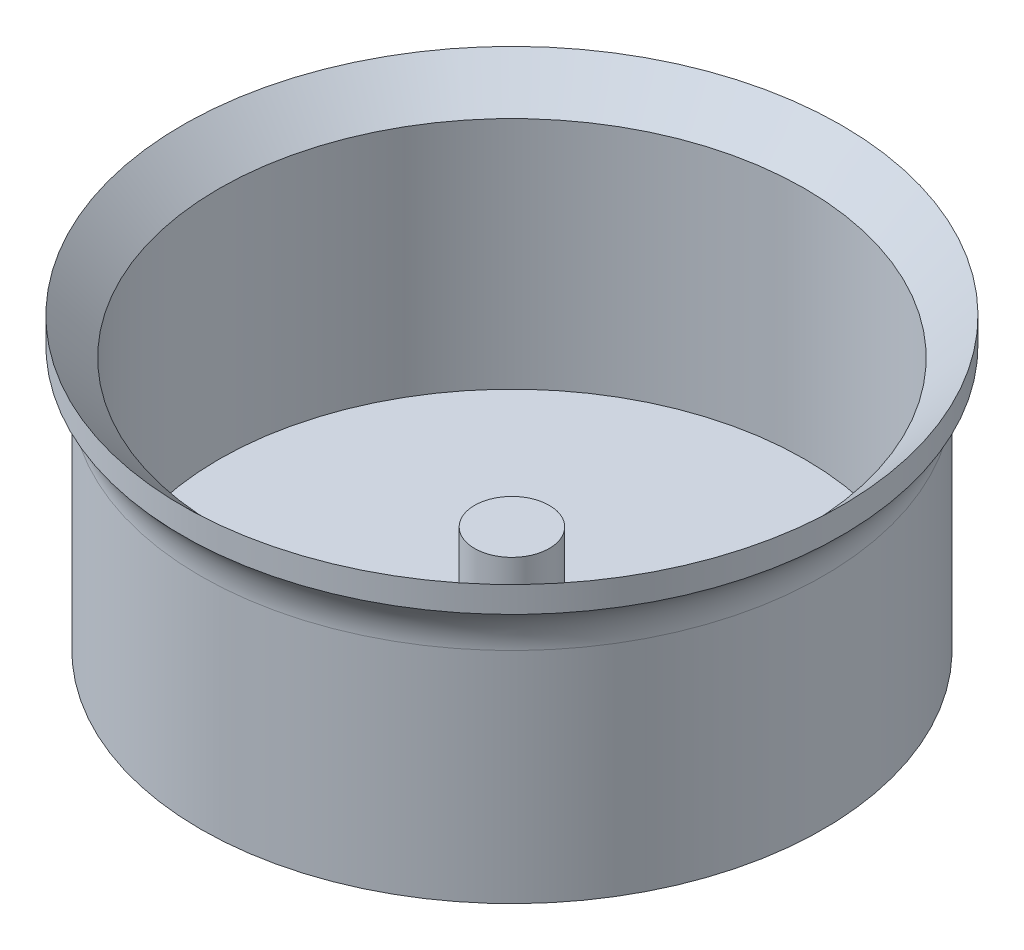
ISO-10303-21;
HEADER;
FILE_DESCRIPTION(('STEP AP214'),'2;1');
FILE_NAME('part.step','',(''),(''),'','','');
FILE_SCHEMA(('AUTOMOTIVE_DESIGN { 1 0 10303 214 1 1 1 1 }'));
ENDSEC;
DATA;
#1=APPLICATION_CONTEXT('core data for automotive mechanical design processes');
#2=APPLICATION_PROTOCOL_DEFINITION('international standard','automotive_design',2000,#1);
#3=PRODUCT_CONTEXT('',#1,'mechanical');
#4=PRODUCT('Part','Part','',(#3));
#5=PRODUCT_RELATED_PRODUCT_CATEGORY('part','',(#4));
#6=PRODUCT_DEFINITION_FORMATION('','',#4);
#7=PRODUCT_DEFINITION_CONTEXT('part definition',#1,'design');
#8=PRODUCT_DEFINITION('design','',#6,#7);
#9=PRODUCT_DEFINITION_SHAPE('','',#8);
#10=(LENGTH_UNIT() NAMED_UNIT(*) SI_UNIT(.MILLI.,.METRE.));
#11=(NAMED_UNIT(*) PLANE_ANGLE_UNIT() SI_UNIT($,.RADIAN.));
#12=(NAMED_UNIT(*) SI_UNIT($,.STERADIAN.) SOLID_ANGLE_UNIT());
#13=UNCERTAINTY_MEASURE_WITH_UNIT(LENGTH_MEASURE(1.E-05),#10,'distance_accuracy_value','');
#14=(GEOMETRIC_REPRESENTATION_CONTEXT(3) GLOBAL_UNCERTAINTY_ASSIGNED_CONTEXT((#13)) GLOBAL_UNIT_ASSIGNED_CONTEXT((#10,
#11,#12)) REPRESENTATION_CONTEXT('',''));
#15=CARTESIAN_POINT('',(0.,0.,0.));
#16=DIRECTION('',(0.,0.,1.));
#17=DIRECTION('',(1.,0.,0.));
#18=AXIS2_PLACEMENT_3D('',#15,#16,#17);
#19=CARTESIAN_POINT('',(0.,0.,-26.9875));
#20=DIRECTION('',(0.,-1.,0.));
#21=DIRECTION('',(0.,0.,-1.));
#22=AXIS2_PLACEMENT_3D('',#19,#20,#21);
#23=PLANE('',#22);
#24=CARTESIAN_POINT('',(0.,0.,0.));
#25=DIRECTION('',(0.,-1.,0.));
#26=DIRECTION('',(0.,0.,-1.));
#27=AXIS2_PLACEMENT_3D('',#24,#25,#26);
#28=CIRCLE('',#27,26.9875);
#29=CARTESIAN_POINT('',(0.,0.,-26.9875));
#30=VERTEX_POINT('',#29);
#31=EDGE_CURVE('E10',#30,#30,#28,.T.);
#32=ORIENTED_EDGE('',*,*,#31,.T.);
#33=EDGE_LOOP('',(#32));
#34=FACE_BOUND('',#33,.T.);
#35=ADVANCED_FACE('F35',(#34),#23,.T.);
#36=CARTESIAN_POINT('',(0.,0.,0.));
#37=DIRECTION('',(0.,-1.,0.));
#38=DIRECTION('',(0.,0.,-1.));
#39=AXIS2_PLACEMENT_3D('',#36,#37,#38);
#40=CYLINDRICAL_SURFACE('',#39,26.9875);
#41=CARTESIAN_POINT('',(0.,19.0048719394654,0.));
#42=DIRECTION('',(0.,-1.,0.));
#43=DIRECTION('',(0.,0.,-1.));
#44=AXIS2_PLACEMENT_3D('',#41,#42,#43);
#45=CIRCLE('',#44,26.9875);
#46=CARTESIAN_POINT('',(0.,19.0048719394654,-26.9875));
#47=VERTEX_POINT('',#46);
#48=EDGE_CURVE('E41',#47,#47,#45,.T.);
#49=ORIENTED_EDGE('',*,*,#48,.T.);
#50=EDGE_LOOP('',(#49));
#51=FACE_BOUND('',#50,.T.);
#52=ORIENTED_EDGE('',*,*,#31,.F.);
#53=EDGE_LOOP('',(#52));
#54=FACE_BOUND('',#53,.T.);
#55=ADVANCED_FACE('F79',(#51,#54),#40,.T.);
#56=CARTESIAN_POINT('',(0.,19.0048719394654,0.));
#57=DIRECTION('',(0.,-1.,0.));
#58=DIRECTION('',(0.,0.,-1.));
#59=AXIS2_PLACEMENT_3D('',#56,#57,#58);
#60=TOROIDAL_SURFACE('',#59,32.4075640302673,5.42006403026728);
#61=CARTESIAN_POINT('',(0.,22.8374359697327,0.));
#62=DIRECTION('',(0.,-1.,0.));
#63=DIRECTION('',(0.,0.,-1.));
#64=AXIS2_PLACEMENT_3D('',#61,#62,#63);
#65=CIRCLE('',#64,28.575);
#66=CARTESIAN_POINT('',(0.,22.8374359697327,-28.575));
#67=VERTEX_POINT('',#66);
#68=EDGE_CURVE('E45',#67,#67,#65,.T.);
#69=ORIENTED_EDGE('',*,*,#68,.T.);
#70=EDGE_LOOP('',(#69));
#71=FACE_BOUND('',#70,.T.);
#72=ORIENTED_EDGE('',*,*,#48,.F.);
#73=EDGE_LOOP('',(#72));
#74=FACE_BOUND('',#73,.T.);
#75=ADVANCED_FACE('F83',(#71,#74),#60,.F.);
#76=CARTESIAN_POINT('',(0.,0.,0.));
#77=DIRECTION('',(0.,-1.,0.));
#78=DIRECTION('',(0.,0.,-1.));
#79=AXIS2_PLACEMENT_3D('',#76,#77,#78);
#80=CYLINDRICAL_SURFACE('',#79,28.575);
#81=CARTESIAN_POINT('',(0.,25.0825,0.));
#82=DIRECTION('',(0.,-1.,0.));
#83=DIRECTION('',(0.,0.,-1.));
#84=AXIS2_PLACEMENT_3D('',#81,#82,#83);
#85=CIRCLE('',#84,28.575);
#86=CARTESIAN_POINT('',(0.,25.0825,-28.575));
#87=VERTEX_POINT('',#86);
#88=EDGE_CURVE('E49',#87,#87,#85,.T.);
#89=ORIENTED_EDGE('',*,*,#88,.T.);
#90=EDGE_LOOP('',(#89));
#91=FACE_BOUND('',#90,.T.);
#92=ORIENTED_EDGE('',*,*,#68,.F.);
#93=EDGE_LOOP('',(#92));
#94=FACE_BOUND('',#93,.T.);
#95=ADVANCED_FACE('F87',(#91,#94),#80,.T.);
#96=CARTESIAN_POINT('',(0.,25.0825,0.));
#97=DIRECTION('',(0.,1.,0.));
#98=DIRECTION('',(0.,0.,1.));
#99=AXIS2_PLACEMENT_3D('',#96,#97,#98);
#100=CONICAL_SURFACE('',#99,28.575,0.78539816339745);
#101=CARTESIAN_POINT('',(0.,21.9075,0.));
#102=DIRECTION('',(0.,-1.,0.));
#103=DIRECTION('',(0.,0.,-1.));
#104=AXIS2_PLACEMENT_3D('',#101,#102,#103);
#105=CIRCLE('',#104,25.4);
#106=CARTESIAN_POINT('',(0.,21.9075,-25.4));
#107=VERTEX_POINT('',#106);
#108=EDGE_CURVE('E54',#107,#107,#105,.T.);
#109=ORIENTED_EDGE('',*,*,#108,.T.);
#110=EDGE_LOOP('',(#109));
#111=FACE_BOUND('',#110,.T.);
#112=ORIENTED_EDGE('',*,*,#88,.F.);
#113=EDGE_LOOP('',(#112));
#114=FACE_BOUND('',#113,.T.);
#115=ADVANCED_FACE('F94',(#111,#114),#100,.F.);
#116=CARTESIAN_POINT('',(0.,0.,0.));
#117=DIRECTION('',(0.,-1.,0.));
#118=DIRECTION('',(0.,0.,-1.));
#119=AXIS2_PLACEMENT_3D('',#116,#117,#118);
#120=CYLINDRICAL_SURFACE('',#119,25.4);
#121=CARTESIAN_POINT('',(0.,1.5875,0.));
#122=DIRECTION('',(0.,-1.,0.));
#123=DIRECTION('',(0.,0.,-1.));
#124=AXIS2_PLACEMENT_3D('',#121,#122,#123);
#125=CIRCLE('',#124,25.4);
#126=CARTESIAN_POINT('',(0.,1.5875,-25.4));
#127=VERTEX_POINT('',#126);
#128=EDGE_CURVE('E57',#127,#127,#125,.T.);
#129=ORIENTED_EDGE('',*,*,#128,.T.);
#130=EDGE_LOOP('',(#129));
#131=FACE_BOUND('',#130,.T.);
#132=ORIENTED_EDGE('',*,*,#108,.F.);
#133=EDGE_LOOP('',(#132));
#134=FACE_BOUND('',#133,.T.);
#135=ADVANCED_FACE('F98',(#131,#134),#120,.F.);
#136=CARTESIAN_POINT('',(0.,1.5875,-3.2385));
#137=DIRECTION('',(0.,1.,0.));
#138=DIRECTION('',(0.,0.,1.));
#139=AXIS2_PLACEMENT_3D('',#136,#137,#138);
#140=PLANE('',#139);
#141=CARTESIAN_POINT('',(0.,1.5875,0.));
#142=DIRECTION('',(0.,-1.,0.));
#143=DIRECTION('',(0.,0.,-1.));
#144=AXIS2_PLACEMENT_3D('',#141,#142,#143);
#145=CIRCLE('',#144,3.2385);
#146=CARTESIAN_POINT('',(0.,1.5875,-3.2385));
#147=VERTEX_POINT('',#146);
#148=EDGE_CURVE('E60',#147,#147,#145,.T.);
#149=ORIENTED_EDGE('',*,*,#148,.T.);
#150=EDGE_LOOP('',(#149));
#151=FACE_BOUND('',#150,.T.);
#152=ORIENTED_EDGE('',*,*,#128,.F.);
#153=EDGE_LOOP('',(#152));
#154=FACE_BOUND('',#153,.T.);
#155=ADVANCED_FACE('F76',(#151,#154),#140,.T.);
#156=CARTESIAN_POINT('',(0.,0.,0.));
#157=DIRECTION('',(0.,-1.,0.));
#158=DIRECTION('',(0.,0.,-1.));
#159=AXIS2_PLACEMENT_3D('',#156,#157,#158);
#160=CYLINDRICAL_SURFACE('',#159,3.2385);
#161=CARTESIAN_POINT('',(0.,9.2075,0.));
#162=DIRECTION('',(0.,-1.,0.));
#163=DIRECTION('',(0.,0.,-1.));
#164=AXIS2_PLACEMENT_3D('',#161,#162,#163);
#165=CIRCLE('',#164,3.2385);
#166=CARTESIAN_POINT('',(0.,9.2075,-3.2385));
#167=VERTEX_POINT('',#166);
#168=EDGE_CURVE('E63',#167,#167,#165,.T.);
#169=ORIENTED_EDGE('',*,*,#168,.T.);
#170=EDGE_LOOP('',(#169));
#171=FACE_BOUND('',#170,.T.);
#172=ORIENTED_EDGE('',*,*,#148,.F.);
#173=EDGE_LOOP('',(#172));
#174=FACE_BOUND('',#173,.T.);
#175=ADVANCED_FACE('F67',(#171,#174),#160,.T.);
#176=CARTESIAN_POINT('',(0.,9.2075,0.));
#177=DIRECTION('',(0.,1.,0.));
#178=DIRECTION('',(0.,0.,1.));
#179=AXIS2_PLACEMENT_3D('',#176,#177,#178);
#180=PLANE('',#179);
#181=ORIENTED_EDGE('',*,*,#168,.F.);
#182=EDGE_LOOP('',(#181));
#183=FACE_BOUND('',#182,.T.);
#184=ADVANCED_FACE('F70',(#183),#180,.T.);
#185=CLOSED_SHELL('',(#35,#55,#75,#95,#115,#135,#155,#175,#184));
#186=MANIFOLD_SOLID_BREP('B2',#185);
#187=ADVANCED_BREP_SHAPE_REPRESENTATION('',(#18,#186),#14);
#188=SHAPE_DEFINITION_REPRESENTATION(#9,#187);
ENDSEC;
END-ISO-10303-21;
